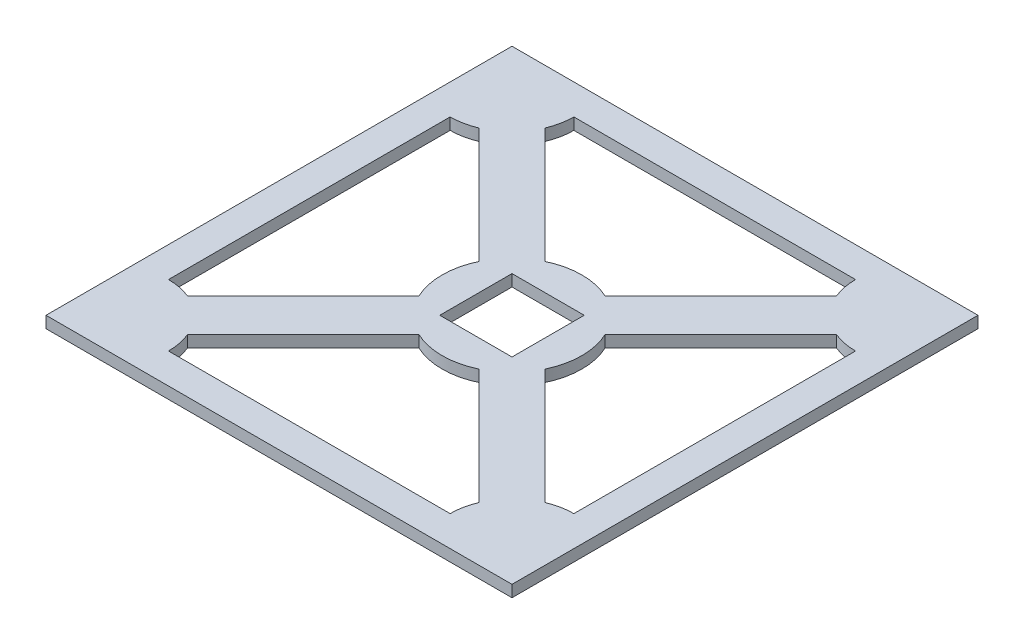
ISO-10303-21;
HEADER;
FILE_DESCRIPTION(('STEP AP214'),'2;1');
FILE_NAME('part.step','',(''),(''),'','','');
FILE_SCHEMA(('AUTOMOTIVE_DESIGN { 1 0 10303 214 1 1 1 1 }'));
ENDSEC;
DATA;
#1=APPLICATION_CONTEXT('core data for automotive mechanical design processes');
#2=APPLICATION_PROTOCOL_DEFINITION('international standard','automotive_design',2000,#1);
#3=PRODUCT_CONTEXT('',#1,'mechanical');
#4=PRODUCT('Part','Part','',(#3));
#5=PRODUCT_RELATED_PRODUCT_CATEGORY('part','',(#4));
#6=PRODUCT_DEFINITION_FORMATION('','',#4);
#7=PRODUCT_DEFINITION_CONTEXT('part definition',#1,'design');
#8=PRODUCT_DEFINITION('design','',#6,#7);
#9=PRODUCT_DEFINITION_SHAPE('','',#8);
#10=(LENGTH_UNIT() NAMED_UNIT(*) SI_UNIT(.MILLI.,.METRE.));
#11=(NAMED_UNIT(*) PLANE_ANGLE_UNIT() SI_UNIT($,.RADIAN.));
#12=(NAMED_UNIT(*) SI_UNIT($,.STERADIAN.) SOLID_ANGLE_UNIT());
#13=UNCERTAINTY_MEASURE_WITH_UNIT(LENGTH_MEASURE(1.E-05),#10,'distance_accuracy_value','');
#14=(GEOMETRIC_REPRESENTATION_CONTEXT(3) GLOBAL_UNCERTAINTY_ASSIGNED_CONTEXT((#13)) GLOBAL_UNIT_ASSIGNED_CONTEXT((#10,
#11,#12)) REPRESENTATION_CONTEXT('',''));
#15=CARTESIAN_POINT('',(0.,0.,0.));
#16=DIRECTION('',(0.,0.,1.));
#17=DIRECTION('',(1.,0.,0.));
#18=AXIS2_PLACEMENT_3D('',#15,#16,#17);
#19=CARTESIAN_POINT('',(0.,0.,0.));
#20=DIRECTION('',(0.,1.,0.));
#21=DIRECTION('',(0.,0.,1.));
#22=AXIS2_PLACEMENT_3D('',#19,#20,#21);
#23=CYLINDRICAL_SURFACE('',#22,15.);
#24=CARTESIAN_POINT('',(0.,2.5,0.));
#25=DIRECTION('',(0.,1.,0.));
#26=DIRECTION('',(0.,0.,1.));
#27=AXIS2_PLACEMENT_3D('',#24,#25,#26);
#28=CIRCLE('',#27,15.);
#29=CARTESIAN_POINT('',(-13.5355339059327,2.5,-6.46446609406726));
#30=VERTEX_POINT('',#29);
#31=CARTESIAN_POINT('',(-13.5355339059327,2.5,6.46446609406726));
#32=VERTEX_POINT('',#31);
#33=EDGE_CURVE('E281',#30,#32,#28,.T.);
#34=ORIENTED_EDGE('',*,*,#33,.F.);
#35=DIRECTION('',(0.,1.,0.));
#36=VECTOR('',#35,1.);
#37=CARTESIAN_POINT('',(-13.5355339059327,0.,-6.46446609406726));
#38=LINE('',#37,#36);
#39=CARTESIAN_POINT('',(-13.5355339059327,0.,-6.46446609406726));
#40=VERTEX_POINT('',#39);
#41=EDGE_CURVE('E272',#30,#40,#38,.F.);
#42=ORIENTED_EDGE('',*,*,#41,.T.);
#43=CARTESIAN_POINT('',(0.,0.,0.));
#44=DIRECTION('',(0.,1.,0.));
#45=DIRECTION('',(0.,0.,1.));
#46=AXIS2_PLACEMENT_3D('',#43,#44,#45);
#47=CIRCLE('',#46,15.);
#48=CARTESIAN_POINT('',(-13.5355339059327,0.,6.46446609406726));
#49=VERTEX_POINT('',#48);
#50=EDGE_CURVE('E319',#40,#49,#47,.T.);
#51=ORIENTED_EDGE('',*,*,#50,.T.);
#52=DIRECTION('',(0.,1.,0.));
#53=VECTOR('',#52,1.);
#54=CARTESIAN_POINT('',(-13.5355339059327,0.,6.46446609406726));
#55=LINE('',#54,#53);
#56=EDGE_CURVE('E523',#32,#49,#55,.F.);
#57=ORIENTED_EDGE('',*,*,#56,.F.);
#58=EDGE_LOOP('',(#34,#42,#51,#57));
#59=FACE_BOUND('',#58,.T.);
#60=ADVANCED_FACE('F47',(#59),#23,.T.);
#61=CARTESIAN_POINT('',(-43.5,0.,-43.5));
#62=DIRECTION('',(0.,1.,0.));
#63=DIRECTION('',(0.,0.,1.));
#64=AXIS2_PLACEMENT_3D('',#61,#62,#63);
#65=CYLINDRICAL_SURFACE('',#64,13.279930536569);
#66=CARTESIAN_POINT('',(-43.5,0.,-43.5));
#67=DIRECTION('',(0.,1.,0.));
#68=DIRECTION('',(0.,0.,1.));
#69=AXIS2_PLACEMENT_3D('',#66,#67,#68);
#70=CIRCLE('',#69,13.279930536569);
#71=CARTESIAN_POINT('',(-43.5,0.,-30.220069463431));
#72=VERTEX_POINT('',#71);
#73=CARTESIAN_POINT('',(-38.3362076373043,0.,-31.2651398254388));
#74=VERTEX_POINT('',#73);
#75=EDGE_CURVE('E552',#72,#74,#70,.T.);
#76=ORIENTED_EDGE('',*,*,#75,.T.);
#77=DIRECTION('',(0.,1.,0.));
#78=VECTOR('',#77,1.);
#79=CARTESIAN_POINT('',(-38.3362076373043,0.,-31.2651398254388));
#80=LINE('',#79,#78);
#81=CARTESIAN_POINT('',(-38.3362076373043,2.5,-31.2651398254388));
#82=VERTEX_POINT('',#81);
#83=EDGE_CURVE('E56',#74,#82,#80,.T.);
#84=ORIENTED_EDGE('',*,*,#83,.T.);
#85=CARTESIAN_POINT('',(-43.5,2.5,-43.5));
#86=DIRECTION('',(0.,1.,0.));
#87=DIRECTION('',(0.,0.,1.));
#88=AXIS2_PLACEMENT_3D('',#85,#86,#87);
#89=CIRCLE('',#88,13.279930536569);
#90=CARTESIAN_POINT('',(-43.5,2.5,-30.220069463431));
#91=VERTEX_POINT('',#90);
#92=EDGE_CURVE('E558',#91,#82,#89,.T.);
#93=ORIENTED_EDGE('',*,*,#92,.F.);
#94=DIRECTION('',(0.,1.,0.));
#95=VECTOR('',#94,1.);
#96=CARTESIAN_POINT('',(-43.5,0.,-30.220069463431));
#97=LINE('',#96,#95);
#98=EDGE_CURVE('E556',#72,#91,#97,.T.);
#99=ORIENTED_EDGE('',*,*,#98,.F.);
#100=EDGE_LOOP('',(#76,#84,#93,#99));
#101=FACE_BOUND('',#100,.T.);
#102=ADVANCED_FACE('F425',(#101),#65,.T.);
#103=DIRECTION('',(0.,1.,0.));
#104=VECTOR('',#103,1.);
#105=CARTESIAN_POINT('',(-6.46446609406726,0.,-13.5355339059327));
#106=LINE('',#105,#104);
#107=CARTESIAN_POINT('',(-6.46446609406726,2.5,-13.5355339059327));
#108=VERTEX_POINT('',#107);
#109=CARTESIAN_POINT('',(-6.46446609406726,0.,-13.5355339059327));
#110=VERTEX_POINT('',#109);
#111=EDGE_CURVE('E256',#108,#110,#106,.F.);
#112=ORIENTED_EDGE('',*,*,#111,.F.);
#113=CARTESIAN_POINT('',(6.46446609406726,2.5,-13.5355339059327));
#114=VERTEX_POINT('',#113);
#115=EDGE_CURVE('E267',#114,#108,#28,.T.);
#116=ORIENTED_EDGE('',*,*,#115,.F.);
#117=DIRECTION('',(0.,1.,0.));
#118=VECTOR('',#117,1.);
#119=CARTESIAN_POINT('',(6.46446609406726,0.,-13.5355339059327));
#120=LINE('',#119,#118);
#121=CARTESIAN_POINT('',(6.46446609406726,0.,-13.5355339059327));
#122=VERTEX_POINT('',#121);
#123=EDGE_CURVE('E500',#114,#122,#120,.F.);
#124=ORIENTED_EDGE('',*,*,#123,.T.);
#125=EDGE_CURVE('E269',#122,#110,#47,.T.);
#126=ORIENTED_EDGE('',*,*,#125,.T.);
#127=EDGE_LOOP('',(#112,#116,#124,#126));
#128=FACE_BOUND('',#127,.T.);
#129=ADVANCED_FACE('F265',(#128),#23,.T.);
#130=CARTESIAN_POINT('',(43.5,0.,-43.5));
#131=DIRECTION('',(0.,1.,0.));
#132=DIRECTION('',(0.,0.,1.));
#133=AXIS2_PLACEMENT_3D('',#130,#131,#132);
#134=CYLINDRICAL_SURFACE('',#133,13.279930536569);
#135=DIRECTION('',(0.,1.,0.));
#136=VECTOR('',#135,1.);
#137=CARTESIAN_POINT('',(31.2651398254388,0.,-38.3362076373043));
#138=LINE('',#137,#136);
#139=CARTESIAN_POINT('',(31.2651398254388,2.5,-38.3362076373043));
#140=VERTEX_POINT('',#139);
#141=CARTESIAN_POINT('',(31.2651398254388,0.,-38.3362076373043));
#142=VERTEX_POINT('',#141);
#143=EDGE_CURVE('E489',#140,#142,#138,.F.);
#144=ORIENTED_EDGE('',*,*,#143,.F.);
#145=CARTESIAN_POINT('',(43.5,2.5,-43.5));
#146=DIRECTION('',(0.,1.,0.));
#147=DIRECTION('',(0.,0.,1.));
#148=AXIS2_PLACEMENT_3D('',#145,#146,#147);
#149=CIRCLE('',#148,13.279930536569);
#150=CARTESIAN_POINT('',(30.220069463431,2.5,-43.5));
#151=VERTEX_POINT('',#150);
#152=EDGE_CURVE('E481',#140,#151,#149,.F.);
#153=ORIENTED_EDGE('',*,*,#152,.T.);
#154=DIRECTION('',(0.,1.,0.));
#155=VECTOR('',#154,1.);
#156=CARTESIAN_POINT('',(30.220069463431,0.,-43.5));
#157=LINE('',#156,#155);
#158=CARTESIAN_POINT('',(30.220069463431,0.,-43.5));
#159=VERTEX_POINT('',#158);
#160=EDGE_CURVE('E545',#159,#151,#157,.T.);
#161=ORIENTED_EDGE('',*,*,#160,.F.);
#162=CARTESIAN_POINT('',(43.5,0.,-43.5));
#163=DIRECTION('',(0.,1.,0.));
#164=DIRECTION('',(0.,0.,1.));
#165=AXIS2_PLACEMENT_3D('',#162,#163,#164);
#166=CIRCLE('',#165,13.279930536569);
#167=EDGE_CURVE('E480',#142,#159,#166,.F.);
#168=ORIENTED_EDGE('',*,*,#167,.F.);
#169=EDGE_LOOP('',(#144,#153,#161,#168));
#170=FACE_BOUND('',#169,.T.);
#171=ADVANCED_FACE('F435',(#170),#134,.T.);
#172=CARTESIAN_POINT('',(-6.46446609406726,2.5,13.5355339059327));
#173=VERTEX_POINT('',#172);
#174=CARTESIAN_POINT('',(6.46446609406726,2.5,13.5355339059327));
#175=VERTEX_POINT('',#174);
#176=EDGE_CURVE('E283',#173,#175,#28,.T.);
#177=ORIENTED_EDGE('',*,*,#176,.F.);
#178=DIRECTION('',(0.,1.,0.));
#179=VECTOR('',#178,1.);
#180=CARTESIAN_POINT('',(-6.46446609406726,0.,13.5355339059327));
#181=LINE('',#180,#179);
#182=CARTESIAN_POINT('',(-6.46446609406726,0.,13.5355339059327));
#183=VERTEX_POINT('',#182);
#184=EDGE_CURVE('E338',#173,#183,#181,.F.);
#185=ORIENTED_EDGE('',*,*,#184,.T.);
#186=CARTESIAN_POINT('',(6.46446609406726,0.,13.5355339059327));
#187=VERTEX_POINT('',#186);
#188=EDGE_CURVE('E287',#183,#187,#47,.T.);
#189=ORIENTED_EDGE('',*,*,#188,.T.);
#190=DIRECTION('',(0.,1.,0.));
#191=VECTOR('',#190,1.);
#192=CARTESIAN_POINT('',(6.46446609406726,0.,13.5355339059327));
#193=LINE('',#192,#191);
#194=EDGE_CURVE('E336',#175,#187,#193,.F.);
#195=ORIENTED_EDGE('',*,*,#194,.F.);
#196=EDGE_LOOP('',(#177,#185,#189,#195));
#197=FACE_BOUND('',#196,.T.);
#198=ADVANCED_FACE('F335',(#197),#23,.T.);
#199=CARTESIAN_POINT('',(-43.5,0.,43.5));
#200=DIRECTION('',(0.,1.,0.));
#201=DIRECTION('',(0.,0.,1.));
#202=AXIS2_PLACEMENT_3D('',#199,#200,#201);
#203=CYLINDRICAL_SURFACE('',#202,13.279930536569);
#204=DIRECTION('',(0.,1.,0.));
#205=VECTOR('',#204,1.);
#206=CARTESIAN_POINT('',(-31.2651398254388,0.,38.3362076373043));
#207=LINE('',#206,#205);
#208=CARTESIAN_POINT('',(-31.2651398254388,2.5,38.3362076373043));
#209=VERTEX_POINT('',#208);
#210=CARTESIAN_POINT('',(-31.2651398254388,0.,38.3362076373043));
#211=VERTEX_POINT('',#210);
#212=EDGE_CURVE('E327',#209,#211,#207,.F.);
#213=ORIENTED_EDGE('',*,*,#212,.F.);
#214=CARTESIAN_POINT('',(-43.5,2.5,43.5));
#215=DIRECTION('',(0.,1.,0.));
#216=DIRECTION('',(0.,0.,1.));
#217=AXIS2_PLACEMENT_3D('',#214,#215,#216);
#218=CIRCLE('',#217,13.279930536569);
#219=CARTESIAN_POINT('',(-30.220069463431,2.5,43.5));
#220=VERTEX_POINT('',#219);
#221=EDGE_CURVE('E565',#209,#220,#218,.F.);
#222=ORIENTED_EDGE('',*,*,#221,.T.);
#223=DIRECTION('',(0.,1.,0.));
#224=VECTOR('',#223,1.);
#225=CARTESIAN_POINT('',(-30.220069463431,0.,43.5));
#226=LINE('',#225,#224);
#227=CARTESIAN_POINT('',(-30.220069463431,0.,43.5));
#228=VERTEX_POINT('',#227);
#229=EDGE_CURVE('E577',#228,#220,#226,.T.);
#230=ORIENTED_EDGE('',*,*,#229,.F.);
#231=CARTESIAN_POINT('',(-43.5,0.,43.5));
#232=DIRECTION('',(0.,1.,0.));
#233=DIRECTION('',(0.,0.,1.));
#234=AXIS2_PLACEMENT_3D('',#231,#232,#233);
#235=CIRCLE('',#234,13.279930536569);
#236=EDGE_CURVE('E573',#211,#228,#235,.F.);
#237=ORIENTED_EDGE('',*,*,#236,.F.);
#238=EDGE_LOOP('',(#213,#222,#230,#237));
#239=FACE_BOUND('',#238,.T.);
#240=ADVANCED_FACE('F437',(#239),#203,.T.);
#241=DIRECTION('',(0.,1.,0.));
#242=VECTOR('',#241,1.);
#243=CARTESIAN_POINT('',(13.5355339059327,0.,-6.46446609406726));
#244=LINE('',#243,#242);
#245=CARTESIAN_POINT('',(13.5355339059327,2.5,-6.46446609406726));
#246=VERTEX_POINT('',#245);
#247=CARTESIAN_POINT('',(13.5355339059327,0.,-6.46446609406726));
#248=VERTEX_POINT('',#247);
#249=EDGE_CURVE('E503',#246,#248,#244,.F.);
#250=ORIENTED_EDGE('',*,*,#249,.F.);
#251=CARTESIAN_POINT('',(13.5355339059327,2.5,6.46446609406726));
#252=VERTEX_POINT('',#251);
#253=EDGE_CURVE('E280',#252,#246,#28,.T.);
#254=ORIENTED_EDGE('',*,*,#253,.F.);
#255=DIRECTION('',(0.,1.,0.));
#256=VECTOR('',#255,1.);
#257=CARTESIAN_POINT('',(13.5355339059327,0.,6.46446609406726));
#258=LINE('',#257,#256);
#259=CARTESIAN_POINT('',(13.5355339059327,0.,6.46446609406726));
#260=VERTEX_POINT('',#259);
#261=EDGE_CURVE('E350',#252,#260,#258,.F.);
#262=ORIENTED_EDGE('',*,*,#261,.T.);
#263=EDGE_CURVE('E315',#260,#248,#47,.T.);
#264=ORIENTED_EDGE('',*,*,#263,.T.);
#265=EDGE_LOOP('',(#250,#254,#262,#264));
#266=FACE_BOUND('',#265,.T.);
#267=ADVANCED_FACE('F49',(#266),#23,.T.);
#268=CARTESIAN_POINT('',(0.,0.,0.));
#269=DIRECTION('',(0.,1.,0.));
#270=DIRECTION('',(0.,0.,1.));
#271=AXIS2_PLACEMENT_3D('',#268,#269,#270);
#272=PLANE('',#271);
#273=ORIENTED_EDGE('',*,*,#50,.F.);
#274=DIRECTION('',(-0.707106781186548,0.,-0.707106781186547));
#275=VECTOR('',#274,1.);
#276=CARTESIAN_POINT('',(-11.2855339059327,0.,-4.21446609406726));
#277=LINE('',#276,#275);
#278=EDGE_CURVE('E679',#40,#74,#277,.T.);
#279=ORIENTED_EDGE('',*,*,#278,.T.);
#280=ORIENTED_EDGE('',*,*,#75,.F.);
#281=DIRECTION('',(0.,0.,-1.));
#282=VECTOR('',#281,1.);
#283=CARTESIAN_POINT('',(-43.5,0.,0.));
#284=LINE('',#283,#282);
#285=CARTESIAN_POINT('',(-43.5,0.,30.220069463431));
#286=VERTEX_POINT('',#285);
#287=EDGE_CURVE('E644',#286,#72,#284,.T.);
#288=ORIENTED_EDGE('',*,*,#287,.F.);
#289=CARTESIAN_POINT('',(-38.3362076373043,0.,31.2651398254388));
#290=VERTEX_POINT('',#289);
#291=EDGE_CURVE('E568',#286,#290,#235,.F.);
#292=ORIENTED_EDGE('',*,*,#291,.T.);
#293=DIRECTION('',(-0.707106781186548,0.,0.707106781186547));
#294=VECTOR('',#293,1.);
#295=CARTESIAN_POINT('',(-11.2855339059327,0.,4.21446609406726));
#296=LINE('',#295,#294);
#297=EDGE_CURVE('E507',#49,#290,#296,.T.);
#298=ORIENTED_EDGE('',*,*,#297,.F.);
#299=EDGE_LOOP('',(#273,#279,#280,#288,#292,#298));
#300=FACE_BOUND('',#299,.T.);
#301=DIRECTION('',(-0.707106781186548,0.,-0.707106781186547));
#302=VECTOR('',#301,1.);
#303=CARTESIAN_POINT('',(-4.21446609406726,0.,-11.2855339059327));
#304=LINE('',#303,#302);
#305=CARTESIAN_POINT('',(-31.2651398254388,0.,-38.3362076373043));
#306=VERTEX_POINT('',#305);
#307=EDGE_CURVE('E681',#110,#306,#304,.T.);
#308=ORIENTED_EDGE('',*,*,#307,.F.);
#309=ORIENTED_EDGE('',*,*,#125,.F.);
#310=DIRECTION('',(0.707106781186548,0.,-0.707106781186547));
#311=VECTOR('',#310,1.);
#312=CARTESIAN_POINT('',(4.21446609406726,0.,-11.2855339059327));
#313=LINE('',#312,#311);
#314=EDGE_CURVE('E497',#122,#142,#313,.T.);
#315=ORIENTED_EDGE('',*,*,#314,.T.);
#316=ORIENTED_EDGE('',*,*,#167,.T.);
#317=DIRECTION('',(1.,0.,0.));
#318=VECTOR('',#317,1.);
#319=CARTESIAN_POINT('',(0.,0.,-43.5));
#320=LINE('',#319,#318);
#321=CARTESIAN_POINT('',(-30.220069463431,0.,-43.5));
#322=VERTEX_POINT('',#321);
#323=EDGE_CURVE('E640',#322,#159,#320,.T.);
#324=ORIENTED_EDGE('',*,*,#323,.F.);
#325=EDGE_CURVE('E557',#306,#322,#70,.T.);
#326=ORIENTED_EDGE('',*,*,#325,.F.);
#327=EDGE_LOOP('',(#308,#309,#315,#316,#324,#326));
#328=FACE_BOUND('',#327,.T.);
#329=DIRECTION('',(-1.,0.,0.));
#330=VECTOR('',#329,1.);
#331=CARTESIAN_POINT('',(-7.75,0.,-7.75));
#332=LINE('',#331,#330);
#333=CARTESIAN_POINT('',(7.75,0.,-7.75));
#334=VERTEX_POINT('',#333);
#335=CARTESIAN_POINT('',(-7.75,0.,-7.75));
#336=VERTEX_POINT('',#335);
#337=EDGE_CURVE('E379',#334,#336,#332,.T.);
#338=ORIENTED_EDGE('',*,*,#337,.T.);
#339=DIRECTION('',(0.,0.,1.));
#340=VECTOR('',#339,1.);
#341=CARTESIAN_POINT('',(-7.75,0.,7.75));
#342=LINE('',#341,#340);
#343=CARTESIAN_POINT('',(-7.75,0.,7.75));
#344=VERTEX_POINT('',#343);
#345=EDGE_CURVE('E383',#336,#344,#342,.T.);
#346=ORIENTED_EDGE('',*,*,#345,.T.);
#347=DIRECTION('',(1.,0.,0.));
#348=VECTOR('',#347,1.);
#349=CARTESIAN_POINT('',(-7.75,0.,7.75));
#350=LINE('',#349,#348);
#351=CARTESIAN_POINT('',(7.75,0.,7.75));
#352=VERTEX_POINT('',#351);
#353=EDGE_CURVE('E314',#344,#352,#350,.T.);
#354=ORIENTED_EDGE('',*,*,#353,.T.);
#355=DIRECTION('',(0.,0.,-1.));
#356=VECTOR('',#355,1.);
#357=CARTESIAN_POINT('',(7.75,0.,7.75));
#358=LINE('',#357,#356);
#359=EDGE_CURVE('E375',#352,#334,#358,.T.);
#360=ORIENTED_EDGE('',*,*,#359,.T.);
#361=EDGE_LOOP('',(#338,#346,#354,#360));
#362=FACE_BOUND('',#361,.T.);
#363=DIRECTION('',(0.707106781186548,0.,-0.707106781186547));
#364=VECTOR('',#363,1.);
#365=CARTESIAN_POINT('',(11.2855339059327,0.,-4.21446609406726));
#366=LINE('',#365,#364);
#367=CARTESIAN_POINT('',(38.3362076373043,0.,-31.2651398254388));
#368=VERTEX_POINT('',#367);
#369=EDGE_CURVE('E487',#248,#368,#366,.T.);
#370=ORIENTED_EDGE('',*,*,#369,.F.);
#371=ORIENTED_EDGE('',*,*,#263,.F.);
#372=DIRECTION('',(0.707106781186548,0.,0.707106781186547));
#373=VECTOR('',#372,1.);
#374=CARTESIAN_POINT('',(11.2855339059327,0.,4.21446609406726));
#375=LINE('',#374,#373);
#376=CARTESIAN_POINT('',(38.3362076373043,0.,31.2651398254388));
#377=VERTEX_POINT('',#376);
#378=EDGE_CURVE('E358',#260,#377,#375,.T.);
#379=ORIENTED_EDGE('',*,*,#378,.T.);
#380=CARTESIAN_POINT('',(43.5,0.,43.5));
#381=DIRECTION('',(0.,1.,0.));
#382=DIRECTION('',(0.,0.,1.));
#383=AXIS2_PLACEMENT_3D('',#380,#381,#382);
#384=CIRCLE('',#383,13.279930536569);
#385=CARTESIAN_POINT('',(43.5,0.,30.220069463431));
#386=VERTEX_POINT('',#385);
#387=EDGE_CURVE('E528',#386,#377,#384,.T.);
#388=ORIENTED_EDGE('',*,*,#387,.F.);
#389=DIRECTION('',(0.,0.,1.));
#390=VECTOR('',#389,1.);
#391=CARTESIAN_POINT('',(43.5,0.,0.));
#392=LINE('',#391,#390);
#393=CARTESIAN_POINT('',(43.5,0.,-30.220069463431));
#394=VERTEX_POINT('',#393);
#395=EDGE_CURVE('E650',#394,#386,#392,.T.);
#396=ORIENTED_EDGE('',*,*,#395,.F.);
#397=EDGE_CURVE('E542',#394,#368,#166,.F.);
#398=ORIENTED_EDGE('',*,*,#397,.T.);
#399=EDGE_LOOP('',(#370,#371,#379,#388,#396,#398));
#400=FACE_BOUND('',#399,.T.);
#401=ORIENTED_EDGE('',*,*,#188,.F.);
#402=DIRECTION('',(-0.707106781186548,0.,0.707106781186547));
#403=VECTOR('',#402,1.);
#404=CARTESIAN_POINT('',(-4.21446609406726,0.,11.2855339059327));
#405=LINE('',#404,#403);
#406=EDGE_CURVE('E511',#183,#211,#405,.T.);
#407=ORIENTED_EDGE('',*,*,#406,.T.);
#408=ORIENTED_EDGE('',*,*,#236,.T.);
#409=DIRECTION('',(-1.,0.,0.));
#410=VECTOR('',#409,1.);
#411=CARTESIAN_POINT('',(0.,0.,43.5));
#412=LINE('',#411,#410);
#413=CARTESIAN_POINT('',(30.220069463431,0.,43.5));
#414=VERTEX_POINT('',#413);
#415=EDGE_CURVE('E647',#414,#228,#412,.T.);
#416=ORIENTED_EDGE('',*,*,#415,.F.);
#417=CARTESIAN_POINT('',(31.2651398254388,0.,38.3362076373043));
#418=VERTEX_POINT('',#417);
#419=EDGE_CURVE('E356',#418,#414,#384,.T.);
#420=ORIENTED_EDGE('',*,*,#419,.F.);
#421=DIRECTION('',(0.707106781186548,0.,0.707106781186547));
#422=VECTOR('',#421,1.);
#423=CARTESIAN_POINT('',(4.21446609406726,0.,11.2855339059327));
#424=LINE('',#423,#422);
#425=EDGE_CURVE('E346',#187,#418,#424,.T.);
#426=ORIENTED_EDGE('',*,*,#425,.F.);
#427=EDGE_LOOP('',(#401,#407,#408,#416,#420,#426));
#428=FACE_BOUND('',#427,.T.);
#429=DIRECTION('',(0.,0.,-1.));
#430=VECTOR('',#429,1.);
#431=CARTESIAN_POINT('',(50.,0.,50.));
#432=LINE('',#431,#430);
#433=CARTESIAN_POINT('',(50.,0.,50.));
#434=VERTEX_POINT('',#433);
#435=CARTESIAN_POINT('',(50.,0.,-50.));
#436=VERTEX_POINT('',#435);
#437=EDGE_CURVE('E598',#434,#436,#432,.T.);
#438=ORIENTED_EDGE('',*,*,#437,.F.);
#439=DIRECTION('',(1.,0.,0.));
#440=VECTOR('',#439,1.);
#441=CARTESIAN_POINT('',(-50.,0.,50.));
#442=LINE('',#441,#440);
#443=CARTESIAN_POINT('',(-50.,0.,50.));
#444=VERTEX_POINT('',#443);
#445=EDGE_CURVE('E604',#444,#434,#442,.T.);
#446=ORIENTED_EDGE('',*,*,#445,.F.);
#447=DIRECTION('',(0.,0.,1.));
#448=VECTOR('',#447,1.);
#449=CARTESIAN_POINT('',(-50.,0.,50.));
#450=LINE('',#449,#448);
#451=CARTESIAN_POINT('',(-50.,0.,-50.));
#452=VERTEX_POINT('',#451);
#453=EDGE_CURVE('E620',#452,#444,#450,.T.);
#454=ORIENTED_EDGE('',*,*,#453,.F.);
#455=DIRECTION('',(-1.,0.,0.));
#456=VECTOR('',#455,1.);
#457=CARTESIAN_POINT('',(-50.,0.,-50.));
#458=LINE('',#457,#456);
#459=EDGE_CURVE('E617',#436,#452,#458,.T.);
#460=ORIENTED_EDGE('',*,*,#459,.F.);
#461=EDGE_LOOP('',(#438,#446,#454,#460));
#462=FACE_BOUND('',#461,.T.);
#463=ADVANCED_FACE('F353',(#300,#328,#362,#400,#428,#462),#272,.F.);
#464=CARTESIAN_POINT('',(0.,2.5,0.));
#465=DIRECTION('',(0.,1.,0.));
#466=DIRECTION('',(0.,0.,1.));
#467=AXIS2_PLACEMENT_3D('',#464,#465,#466);
#468=PLANE('',#467);
#469=DIRECTION('',(-0.707106781186548,0.,-0.707106781186547));
#470=VECTOR('',#469,1.);
#471=CARTESIAN_POINT('',(-11.2855339059327,2.5,-4.21446609406726));
#472=LINE('',#471,#470);
#473=EDGE_CURVE('E63',#30,#82,#472,.T.);
#474=ORIENTED_EDGE('',*,*,#473,.F.);
#475=ORIENTED_EDGE('',*,*,#33,.T.);
#476=DIRECTION('',(-0.707106781186548,0.,0.707106781186547));
#477=VECTOR('',#476,1.);
#478=CARTESIAN_POINT('',(-11.2855339059327,2.5,4.21446609406726));
#479=LINE('',#478,#477);
#480=CARTESIAN_POINT('',(-38.3362076373043,2.5,31.2651398254388));
#481=VERTEX_POINT('',#480);
#482=EDGE_CURVE('E506',#32,#481,#479,.T.);
#483=ORIENTED_EDGE('',*,*,#482,.T.);
#484=CARTESIAN_POINT('',(-43.5,2.5,30.220069463431));
#485=VERTEX_POINT('',#484);
#486=EDGE_CURVE('E574',#485,#481,#218,.F.);
#487=ORIENTED_EDGE('',*,*,#486,.F.);
#488=DIRECTION('',(0.,0.,1.));
#489=VECTOR('',#488,1.);
#490=CARTESIAN_POINT('',(-43.5,2.5,43.5));
#491=LINE('',#490,#489);
#492=EDGE_CURVE('E591',#91,#485,#491,.T.);
#493=ORIENTED_EDGE('',*,*,#492,.F.);
#494=ORIENTED_EDGE('',*,*,#92,.T.);
#495=EDGE_LOOP('',(#474,#475,#483,#487,#493,#494));
#496=FACE_BOUND('',#495,.T.);
#497=ORIENTED_EDGE('',*,*,#115,.T.);
#498=DIRECTION('',(-0.707106781186548,0.,-0.707106781186547));
#499=VECTOR('',#498,1.);
#500=CARTESIAN_POINT('',(-4.21446609406726,2.5,-11.2855339059327));
#501=LINE('',#500,#499);
#502=CARTESIAN_POINT('',(-31.2651398254388,2.5,-38.3362076373043));
#503=VERTEX_POINT('',#502);
#504=EDGE_CURVE('E71',#108,#503,#501,.T.);
#505=ORIENTED_EDGE('',*,*,#504,.T.);
#506=CARTESIAN_POINT('',(-30.220069463431,2.5,-43.5));
#507=VERTEX_POINT('',#506);
#508=EDGE_CURVE('E549',#503,#507,#89,.T.);
#509=ORIENTED_EDGE('',*,*,#508,.T.);
#510=DIRECTION('',(-1.,0.,0.));
#511=VECTOR('',#510,1.);
#512=CARTESIAN_POINT('',(-43.5,2.5,-43.5));
#513=LINE('',#512,#511);
#514=EDGE_CURVE('E587',#151,#507,#513,.T.);
#515=ORIENTED_EDGE('',*,*,#514,.F.);
#516=ORIENTED_EDGE('',*,*,#152,.F.);
#517=DIRECTION('',(0.707106781186548,0.,-0.707106781186547));
#518=VECTOR('',#517,1.);
#519=CARTESIAN_POINT('',(4.21446609406726,2.5,-11.2855339059327));
#520=LINE('',#519,#518);
#521=EDGE_CURVE('E277',#114,#140,#520,.T.);
#522=ORIENTED_EDGE('',*,*,#521,.F.);
#523=EDGE_LOOP('',(#497,#505,#509,#515,#516,#522));
#524=FACE_BOUND('',#523,.T.);
#525=DIRECTION('',(0.,0.,1.));
#526=VECTOR('',#525,1.);
#527=CARTESIAN_POINT('',(-7.75,2.5,7.75));
#528=LINE('',#527,#526);
#529=CARTESIAN_POINT('',(-7.75,2.5,-7.75));
#530=VERTEX_POINT('',#529);
#531=CARTESIAN_POINT('',(-7.75,2.5,7.75));
#532=VERTEX_POINT('',#531);
#533=EDGE_CURVE('E395',#530,#532,#528,.T.);
#534=ORIENTED_EDGE('',*,*,#533,.F.);
#535=DIRECTION('',(-1.,0.,0.));
#536=VECTOR('',#535,1.);
#537=CARTESIAN_POINT('',(-7.75,2.5,-7.75));
#538=LINE('',#537,#536);
#539=CARTESIAN_POINT('',(7.75,2.5,-7.75));
#540=VERTEX_POINT('',#539);
#541=EDGE_CURVE('E392',#540,#530,#538,.T.);
#542=ORIENTED_EDGE('',*,*,#541,.F.);
#543=DIRECTION('',(0.,0.,-1.));
#544=VECTOR('',#543,1.);
#545=CARTESIAN_POINT('',(7.75,2.5,7.75));
#546=LINE('',#545,#544);
#547=CARTESIAN_POINT('',(7.75,2.5,7.75));
#548=VERTEX_POINT('',#547);
#549=EDGE_CURVE('E349',#548,#540,#546,.T.);
#550=ORIENTED_EDGE('',*,*,#549,.F.);
#551=DIRECTION('',(1.,0.,0.));
#552=VECTOR('',#551,1.);
#553=CARTESIAN_POINT('',(-7.75,2.5,7.75));
#554=LINE('',#553,#552);
#555=EDGE_CURVE('E306',#532,#548,#554,.T.);
#556=ORIENTED_EDGE('',*,*,#555,.F.);
#557=EDGE_LOOP('',(#534,#542,#550,#556));
#558=FACE_BOUND('',#557,.T.);
#559=ORIENTED_EDGE('',*,*,#253,.T.);
#560=DIRECTION('',(0.707106781186548,0.,-0.707106781186547));
#561=VECTOR('',#560,1.);
#562=CARTESIAN_POINT('',(11.2855339059327,2.5,-4.21446609406726));
#563=LINE('',#562,#561);
#564=CARTESIAN_POINT('',(38.3362076373043,2.5,-31.2651398254388));
#565=VERTEX_POINT('',#564);
#566=EDGE_CURVE('E271',#246,#565,#563,.T.);
#567=ORIENTED_EDGE('',*,*,#566,.T.);
#568=CARTESIAN_POINT('',(43.5,2.5,-30.220069463431));
#569=VERTEX_POINT('',#568);
#570=EDGE_CURVE('E471',#569,#565,#149,.F.);
#571=ORIENTED_EDGE('',*,*,#570,.F.);
#572=DIRECTION('',(0.,0.,-1.));
#573=VECTOR('',#572,1.);
#574=CARTESIAN_POINT('',(43.5,2.5,43.5));
#575=LINE('',#574,#573);
#576=CARTESIAN_POINT('',(43.5,2.5,30.220069463431));
#577=VERTEX_POINT('',#576);
#578=EDGE_CURVE('E581',#577,#569,#575,.T.);
#579=ORIENTED_EDGE('',*,*,#578,.F.);
#580=CARTESIAN_POINT('',(43.5,2.5,43.5));
#581=DIRECTION('',(0.,1.,0.));
#582=DIRECTION('',(0.,0.,1.));
#583=AXIS2_PLACEMENT_3D('',#580,#581,#582);
#584=CIRCLE('',#583,13.279930536569);
#585=CARTESIAN_POINT('',(38.3362076373043,2.5,31.2651398254388));
#586=VERTEX_POINT('',#585);
#587=EDGE_CURVE('E532',#577,#586,#584,.T.);
#588=ORIENTED_EDGE('',*,*,#587,.T.);
#589=DIRECTION('',(0.707106781186548,0.,0.707106781186547));
#590=VECTOR('',#589,1.);
#591=CARTESIAN_POINT('',(11.2855339059327,2.5,4.21446609406726));
#592=LINE('',#591,#590);
#593=EDGE_CURVE('E359',#252,#586,#592,.T.);
#594=ORIENTED_EDGE('',*,*,#593,.F.);
#595=EDGE_LOOP('',(#559,#567,#571,#579,#588,#594));
#596=FACE_BOUND('',#595,.T.);
#597=DIRECTION('',(-0.707106781186548,0.,0.707106781186547));
#598=VECTOR('',#597,1.);
#599=CARTESIAN_POINT('',(-4.21446609406726,2.5,11.2855339059327));
#600=LINE('',#599,#598);
#601=EDGE_CURVE('E512',#173,#209,#600,.T.);
#602=ORIENTED_EDGE('',*,*,#601,.F.);
#603=ORIENTED_EDGE('',*,*,#176,.T.);
#604=DIRECTION('',(0.707106781186548,0.,0.707106781186547));
#605=VECTOR('',#604,1.);
#606=CARTESIAN_POINT('',(4.21446609406726,2.5,11.2855339059327));
#607=LINE('',#606,#605);
#608=CARTESIAN_POINT('',(31.2651398254388,2.5,38.3362076373043));
#609=VERTEX_POINT('',#608);
#610=EDGE_CURVE('E347',#175,#609,#607,.T.);
#611=ORIENTED_EDGE('',*,*,#610,.T.);
#612=CARTESIAN_POINT('',(30.220069463431,2.5,43.5));
#613=VERTEX_POINT('',#612);
#614=EDGE_CURVE('E527',#609,#613,#584,.T.);
#615=ORIENTED_EDGE('',*,*,#614,.T.);
#616=DIRECTION('',(1.,0.,0.));
#617=VECTOR('',#616,1.);
#618=CARTESIAN_POINT('',(-43.5,2.5,43.5));
#619=LINE('',#618,#617);
#620=EDGE_CURVE('E594',#220,#613,#619,.T.);
#621=ORIENTED_EDGE('',*,*,#620,.F.);
#622=ORIENTED_EDGE('',*,*,#221,.F.);
#623=EDGE_LOOP('',(#602,#603,#611,#615,#621,#622));
#624=FACE_BOUND('',#623,.T.);
#625=DIRECTION('',(0.,0.,-1.));
#626=VECTOR('',#625,1.);
#627=CARTESIAN_POINT('',(50.,2.5,50.));
#628=LINE('',#627,#626);
#629=CARTESIAN_POINT('',(50.,2.5,50.));
#630=VERTEX_POINT('',#629);
#631=CARTESIAN_POINT('',(50.,2.5,-50.));
#632=VERTEX_POINT('',#631);
#633=EDGE_CURVE('E599',#630,#632,#628,.T.);
#634=ORIENTED_EDGE('',*,*,#633,.T.);
#635=DIRECTION('',(-1.,0.,0.));
#636=VECTOR('',#635,1.);
#637=CARTESIAN_POINT('',(-50.,2.5,-50.));
#638=LINE('',#637,#636);
#639=CARTESIAN_POINT('',(-50.,2.5,-50.));
#640=VERTEX_POINT('',#639);
#641=EDGE_CURVE('E603',#632,#640,#638,.T.);
#642=ORIENTED_EDGE('',*,*,#641,.T.);
#643=DIRECTION('',(0.,0.,1.));
#644=VECTOR('',#643,1.);
#645=CARTESIAN_POINT('',(-50.,2.5,50.));
#646=LINE('',#645,#644);
#647=CARTESIAN_POINT('',(-50.,2.5,50.));
#648=VERTEX_POINT('',#647);
#649=EDGE_CURVE('E607',#640,#648,#646,.T.);
#650=ORIENTED_EDGE('',*,*,#649,.T.);
#651=DIRECTION('',(1.,0.,0.));
#652=VECTOR('',#651,1.);
#653=CARTESIAN_POINT('',(-50.,2.5,50.));
#654=LINE('',#653,#652);
#655=EDGE_CURVE('E610',#648,#630,#654,.T.);
#656=ORIENTED_EDGE('',*,*,#655,.T.);
#657=EDGE_LOOP('',(#634,#642,#650,#656));
#658=FACE_BOUND('',#657,.T.);
#659=ADVANCED_FACE('F274',(#496,#524,#558,#596,#624,#658),#468,.T.);
#660=CARTESIAN_POINT('',(7.75,0.,7.75));
#661=DIRECTION('',(1.,0.,0.));
#662=DIRECTION('',(0.,0.,-1.));
#663=AXIS2_PLACEMENT_3D('',#660,#661,#662);
#664=PLANE('',#663);
#665=ORIENTED_EDGE('',*,*,#549,.T.);
#666=DIRECTION('',(0.,1.,0.));
#667=VECTOR('',#666,1.);
#668=CARTESIAN_POINT('',(7.75,0.,-7.75));
#669=LINE('',#668,#667);
#670=EDGE_CURVE('E311',#334,#540,#669,.T.);
#671=ORIENTED_EDGE('',*,*,#670,.F.);
#672=ORIENTED_EDGE('',*,*,#359,.F.);
#673=DIRECTION('',(0.,1.,0.));
#674=VECTOR('',#673,1.);
#675=CARTESIAN_POINT('',(7.75,0.,7.75));
#676=LINE('',#675,#674);
#677=EDGE_CURVE('E291',#352,#548,#676,.T.);
#678=ORIENTED_EDGE('',*,*,#677,.T.);
#679=EDGE_LOOP('',(#665,#671,#672,#678));
#680=FACE_BOUND('',#679,.T.);
#681=ADVANCED_FACE('F408',(#680),#664,.F.);
#682=CARTESIAN_POINT('',(-7.75,0.,7.75));
#683=DIRECTION('',(0.,0.,1.));
#684=DIRECTION('',(1.,0.,0.));
#685=AXIS2_PLACEMENT_3D('',#682,#683,#684);
#686=PLANE('',#685);
#687=ORIENTED_EDGE('',*,*,#555,.T.);
#688=ORIENTED_EDGE('',*,*,#677,.F.);
#689=ORIENTED_EDGE('',*,*,#353,.F.);
#690=DIRECTION('',(0.,1.,0.));
#691=VECTOR('',#690,1.);
#692=CARTESIAN_POINT('',(-7.75,0.,7.75));
#693=LINE('',#692,#691);
#694=EDGE_CURVE('E297',#344,#532,#693,.T.);
#695=ORIENTED_EDGE('',*,*,#694,.T.);
#696=EDGE_LOOP('',(#687,#688,#689,#695));
#697=FACE_BOUND('',#696,.T.);
#698=ADVANCED_FACE('F404',(#697),#686,.F.);
#699=CARTESIAN_POINT('',(-7.75,0.,7.75));
#700=DIRECTION('',(-1.,0.,0.));
#701=DIRECTION('',(0.,0.,1.));
#702=AXIS2_PLACEMENT_3D('',#699,#700,#701);
#703=PLANE('',#702);
#704=ORIENTED_EDGE('',*,*,#533,.T.);
#705=ORIENTED_EDGE('',*,*,#694,.F.);
#706=ORIENTED_EDGE('',*,*,#345,.F.);
#707=DIRECTION('',(0.,1.,0.));
#708=VECTOR('',#707,1.);
#709=CARTESIAN_POINT('',(-7.75,0.,-7.75));
#710=LINE('',#709,#708);
#711=EDGE_CURVE('E303',#336,#530,#710,.T.);
#712=ORIENTED_EDGE('',*,*,#711,.T.);
#713=EDGE_LOOP('',(#704,#705,#706,#712));
#714=FACE_BOUND('',#713,.T.);
#715=ADVANCED_FACE('F415',(#714),#703,.F.);
#716=CARTESIAN_POINT('',(-7.75,0.,-7.75));
#717=DIRECTION('',(0.,0.,-1.));
#718=DIRECTION('',(-1.,0.,0.));
#719=AXIS2_PLACEMENT_3D('',#716,#717,#718);
#720=PLANE('',#719);
#721=ORIENTED_EDGE('',*,*,#541,.T.);
#722=ORIENTED_EDGE('',*,*,#711,.F.);
#723=ORIENTED_EDGE('',*,*,#337,.F.);
#724=ORIENTED_EDGE('',*,*,#670,.T.);
#725=EDGE_LOOP('',(#721,#722,#723,#724));
#726=FACE_BOUND('',#725,.T.);
#727=ADVANCED_FACE('F411',(#726),#720,.F.);
#728=CARTESIAN_POINT('',(4.21446609406726,0.,11.2855339059327));
#729=DIRECTION('',(-0.707106781186547,0.,0.707106781186548));
#730=DIRECTION('',(0.707106781186548,0.,0.707106781186547));
#731=AXIS2_PLACEMENT_3D('',#728,#729,#730);
#732=PLANE('',#731);
#733=DIRECTION('',(0.,1.,0.));
#734=VECTOR('',#733,1.);
#735=CARTESIAN_POINT('',(31.2651398254388,0.,38.3362076373043));
#736=LINE('',#735,#734);
#737=EDGE_CURVE('E368',#609,#418,#736,.F.);
#738=ORIENTED_EDGE('',*,*,#737,.F.);
#739=ORIENTED_EDGE('',*,*,#610,.F.);
#740=ORIENTED_EDGE('',*,*,#194,.T.);
#741=ORIENTED_EDGE('',*,*,#425,.T.);
#742=EDGE_LOOP('',(#738,#739,#740,#741));
#743=FACE_BOUND('',#742,.T.);
#744=ADVANCED_FACE('F345',(#743),#732,.T.);
#745=CARTESIAN_POINT('',(11.2855339059327,0.,4.21446609406726));
#746=DIRECTION('',(-0.707106781186547,0.,0.707106781186548));
#747=DIRECTION('',(0.707106781186548,0.,0.707106781186547));
#748=AXIS2_PLACEMENT_3D('',#745,#746,#747);
#749=PLANE('',#748);
#750=ORIENTED_EDGE('',*,*,#593,.T.);
#751=DIRECTION('',(0.,1.,0.));
#752=VECTOR('',#751,1.);
#753=CARTESIAN_POINT('',(38.3362076373043,0.,31.2651398254388));
#754=LINE('',#753,#752);
#755=EDGE_CURVE('E318',#586,#377,#754,.F.);
#756=ORIENTED_EDGE('',*,*,#755,.T.);
#757=ORIENTED_EDGE('',*,*,#378,.F.);
#758=ORIENTED_EDGE('',*,*,#261,.F.);
#759=EDGE_LOOP('',(#750,#756,#757,#758));
#760=FACE_BOUND('',#759,.T.);
#761=ADVANCED_FACE('F770',(#760),#749,.F.);
#762=CARTESIAN_POINT('',(43.5,0.,43.5));
#763=DIRECTION('',(0.,1.,0.));
#764=DIRECTION('',(0.,0.,1.));
#765=AXIS2_PLACEMENT_3D('',#762,#763,#764);
#766=CYLINDRICAL_SURFACE('',#765,13.279930536569);
#767=ORIENTED_EDGE('',*,*,#755,.F.);
#768=ORIENTED_EDGE('',*,*,#587,.F.);
#769=DIRECTION('',(0.,1.,0.));
#770=VECTOR('',#769,1.);
#771=CARTESIAN_POINT('',(43.5,0.,30.220069463431));
#772=LINE('',#771,#770);
#773=EDGE_CURVE('E531',#386,#577,#772,.T.);
#774=ORIENTED_EDGE('',*,*,#773,.F.);
#775=ORIENTED_EDGE('',*,*,#387,.T.);
#776=EDGE_LOOP('',(#767,#768,#774,#775));
#777=FACE_BOUND('',#776,.T.);
#778=ADVANCED_FACE('F467',(#777),#766,.T.);
#779=CARTESIAN_POINT('',(43.5,-1.5,43.5));
#780=DIRECTION('',(1.,0.,0.));
#781=DIRECTION('',(0.,0.,-1.));
#782=AXIS2_PLACEMENT_3D('',#779,#780,#781);
#783=PLANE('',#782);
#784=ORIENTED_EDGE('',*,*,#395,.T.);
#785=ORIENTED_EDGE('',*,*,#773,.T.);
#786=ORIENTED_EDGE('',*,*,#578,.T.);
#787=DIRECTION('',(0.,1.,0.));
#788=VECTOR('',#787,1.);
#789=CARTESIAN_POINT('',(43.5,0.,-30.220069463431));
#790=LINE('',#789,#788);
#791=EDGE_CURVE('E476',#394,#569,#790,.T.);
#792=ORIENTED_EDGE('',*,*,#791,.F.);
#793=EDGE_LOOP('',(#784,#785,#786,#792));
#794=FACE_BOUND('',#793,.T.);
#795=ADVANCED_FACE('F756',(#794),#783,.F.);
#796=CARTESIAN_POINT('',(-43.5,-1.5,-43.5));
#797=DIRECTION('',(0.,0.,-1.));
#798=DIRECTION('',(-1.,0.,0.));
#799=AXIS2_PLACEMENT_3D('',#796,#797,#798);
#800=PLANE('',#799);
#801=ORIENTED_EDGE('',*,*,#160,.T.);
#802=ORIENTED_EDGE('',*,*,#514,.T.);
#803=DIRECTION('',(0.,1.,0.));
#804=VECTOR('',#803,1.);
#805=CARTESIAN_POINT('',(-30.220069463431,0.,-43.5));
#806=LINE('',#805,#804);
#807=EDGE_CURVE('E561',#322,#507,#806,.T.);
#808=ORIENTED_EDGE('',*,*,#807,.F.);
#809=ORIENTED_EDGE('',*,*,#323,.T.);
#810=EDGE_LOOP('',(#801,#802,#808,#809));
#811=FACE_BOUND('',#810,.T.);
#812=ADVANCED_FACE('F693',(#811),#800,.F.);
#813=CARTESIAN_POINT('',(-43.5,-1.5,43.5));
#814=DIRECTION('',(0.,0.,1.));
#815=DIRECTION('',(1.,0.,0.));
#816=AXIS2_PLACEMENT_3D('',#813,#814,#815);
#817=PLANE('',#816);
#818=ORIENTED_EDGE('',*,*,#620,.T.);
#819=DIRECTION('',(0.,1.,0.));
#820=VECTOR('',#819,1.);
#821=CARTESIAN_POINT('',(30.220069463431,0.,43.5));
#822=LINE('',#821,#820);
#823=EDGE_CURVE('E536',#414,#613,#822,.T.);
#824=ORIENTED_EDGE('',*,*,#823,.F.);
#825=ORIENTED_EDGE('',*,*,#415,.T.);
#826=ORIENTED_EDGE('',*,*,#229,.T.);
#827=EDGE_LOOP('',(#818,#824,#825,#826));
#828=FACE_BOUND('',#827,.T.);
#829=ADVANCED_FACE('F661',(#828),#817,.F.);
#830=CARTESIAN_POINT('',(-43.5,-1.5,43.5));
#831=DIRECTION('',(-1.,0.,0.));
#832=DIRECTION('',(0.,0.,1.));
#833=AXIS2_PLACEMENT_3D('',#830,#831,#832);
#834=PLANE('',#833);
#835=ORIENTED_EDGE('',*,*,#287,.T.);
#836=ORIENTED_EDGE('',*,*,#98,.T.);
#837=ORIENTED_EDGE('',*,*,#492,.T.);
#838=DIRECTION('',(0.,1.,0.));
#839=VECTOR('',#838,1.);
#840=CARTESIAN_POINT('',(-43.5,0.,30.220069463431));
#841=LINE('',#840,#839);
#842=EDGE_CURVE('E572',#286,#485,#841,.T.);
#843=ORIENTED_EDGE('',*,*,#842,.F.);
#844=EDGE_LOOP('',(#835,#836,#837,#843));
#845=FACE_BOUND('',#844,.T.);
#846=ADVANCED_FACE('F741',(#845),#834,.F.);
#847=CARTESIAN_POINT('',(50.,2.5,50.));
#848=DIRECTION('',(-1.,0.,0.));
#849=DIRECTION('',(0.,0.,1.));
#850=AXIS2_PLACEMENT_3D('',#847,#848,#849);
#851=PLANE('',#850);
#852=ORIENTED_EDGE('',*,*,#437,.T.);
#853=DIRECTION('',(0.,-1.,0.));
#854=VECTOR('',#853,1.);
#855=CARTESIAN_POINT('',(50.,2.5,-50.));
#856=LINE('',#855,#854);
#857=EDGE_CURVE('E636',#632,#436,#856,.T.);
#858=ORIENTED_EDGE('',*,*,#857,.F.);
#859=ORIENTED_EDGE('',*,*,#633,.F.);
#860=DIRECTION('',(0.,-1.,0.));
#861=VECTOR('',#860,1.);
#862=CARTESIAN_POINT('',(50.,2.5,50.));
#863=LINE('',#862,#861);
#864=EDGE_CURVE('E613',#630,#434,#863,.T.);
#865=ORIENTED_EDGE('',*,*,#864,.T.);
#866=EDGE_LOOP('',(#852,#858,#859,#865));
#867=FACE_BOUND('',#866,.T.);
#868=ADVANCED_FACE('F743',(#867),#851,.F.);
#869=CARTESIAN_POINT('',(-50.,2.5,-50.));
#870=DIRECTION('',(0.,0.,1.));
#871=DIRECTION('',(1.,0.,0.));
#872=AXIS2_PLACEMENT_3D('',#869,#870,#871);
#873=PLANE('',#872);
#874=ORIENTED_EDGE('',*,*,#459,.T.);
#875=DIRECTION('',(0.,-1.,0.));
#876=VECTOR('',#875,1.);
#877=CARTESIAN_POINT('',(-50.,2.5,-50.));
#878=LINE('',#877,#876);
#879=EDGE_CURVE('E632',#640,#452,#878,.T.);
#880=ORIENTED_EDGE('',*,*,#879,.F.);
#881=ORIENTED_EDGE('',*,*,#641,.F.);
#882=ORIENTED_EDGE('',*,*,#857,.T.);
#883=EDGE_LOOP('',(#874,#880,#881,#882));
#884=FACE_BOUND('',#883,.T.);
#885=ADVANCED_FACE('F749',(#884),#873,.F.);
#886=CARTESIAN_POINT('',(-50.,2.5,50.));
#887=DIRECTION('',(1.,0.,0.));
#888=DIRECTION('',(0.,0.,-1.));
#889=AXIS2_PLACEMENT_3D('',#886,#887,#888);
#890=PLANE('',#889);
#891=ORIENTED_EDGE('',*,*,#453,.T.);
#892=DIRECTION('',(0.,-1.,0.));
#893=VECTOR('',#892,1.);
#894=CARTESIAN_POINT('',(-50.,2.5,50.));
#895=LINE('',#894,#893);
#896=EDGE_CURVE('E628',#648,#444,#895,.T.);
#897=ORIENTED_EDGE('',*,*,#896,.F.);
#898=ORIENTED_EDGE('',*,*,#649,.F.);
#899=ORIENTED_EDGE('',*,*,#879,.T.);
#900=EDGE_LOOP('',(#891,#897,#898,#899));
#901=FACE_BOUND('',#900,.T.);
#902=ADVANCED_FACE('F762',(#901),#890,.F.);
#903=CARTESIAN_POINT('',(-50.,2.5,50.));
#904=DIRECTION('',(0.,0.,-1.));
#905=DIRECTION('',(-1.,0.,0.));
#906=AXIS2_PLACEMENT_3D('',#903,#904,#905);
#907=PLANE('',#906);
#908=ORIENTED_EDGE('',*,*,#445,.T.);
#909=ORIENTED_EDGE('',*,*,#864,.F.);
#910=ORIENTED_EDGE('',*,*,#655,.F.);
#911=ORIENTED_EDGE('',*,*,#896,.T.);
#912=EDGE_LOOP('',(#908,#909,#910,#911));
#913=FACE_BOUND('',#912,.T.);
#914=ADVANCED_FACE('F759',(#913),#907,.F.);
#915=ORIENTED_EDGE('',*,*,#486,.T.);
#916=DIRECTION('',(0.,1.,0.));
#917=VECTOR('',#916,1.);
#918=CARTESIAN_POINT('',(-38.3362076373043,0.,31.2651398254388));
#919=LINE('',#918,#917);
#920=EDGE_CURVE('E698',#481,#290,#919,.F.);
#921=ORIENTED_EDGE('',*,*,#920,.T.);
#922=ORIENTED_EDGE('',*,*,#291,.F.);
#923=ORIENTED_EDGE('',*,*,#842,.T.);
#924=EDGE_LOOP('',(#915,#921,#922,#923));
#925=FACE_BOUND('',#924,.T.);
#926=ADVANCED_FACE('F446',(#925),#203,.T.);
#927=DIRECTION('',(0.,1.,0.));
#928=VECTOR('',#927,1.);
#929=CARTESIAN_POINT('',(-31.2651398254388,0.,-38.3362076373043));
#930=LINE('',#929,#928);
#931=EDGE_CURVE('E11',#306,#503,#930,.T.);
#932=ORIENTED_EDGE('',*,*,#931,.F.);
#933=ORIENTED_EDGE('',*,*,#325,.T.);
#934=ORIENTED_EDGE('',*,*,#807,.T.);
#935=ORIENTED_EDGE('',*,*,#508,.F.);
#936=EDGE_LOOP('',(#932,#933,#934,#935));
#937=FACE_BOUND('',#936,.T.);
#938=ADVANCED_FACE('F432',(#937),#65,.T.);
#939=ORIENTED_EDGE('',*,*,#570,.T.);
#940=DIRECTION('',(0.,1.,0.));
#941=VECTOR('',#940,1.);
#942=CARTESIAN_POINT('',(38.3362076373043,0.,-31.2651398254388));
#943=LINE('',#942,#941);
#944=EDGE_CURVE('E474',#565,#368,#943,.F.);
#945=ORIENTED_EDGE('',*,*,#944,.T.);
#946=ORIENTED_EDGE('',*,*,#397,.F.);
#947=ORIENTED_EDGE('',*,*,#791,.T.);
#948=EDGE_LOOP('',(#939,#945,#946,#947));
#949=FACE_BOUND('',#948,.T.);
#950=ADVANCED_FACE('F453',(#949),#134,.T.);
#951=ORIENTED_EDGE('',*,*,#614,.F.);
#952=ORIENTED_EDGE('',*,*,#737,.T.);
#953=ORIENTED_EDGE('',*,*,#419,.T.);
#954=ORIENTED_EDGE('',*,*,#823,.T.);
#955=EDGE_LOOP('',(#951,#952,#953,#954));
#956=FACE_BOUND('',#955,.T.);
#957=ADVANCED_FACE('F459',(#956),#766,.T.);
#958=CARTESIAN_POINT('',(-11.2855339059327,0.,4.21446609406726));
#959=DIRECTION('',(-0.707106781186547,0.,-0.707106781186548));
#960=DIRECTION('',(-0.707106781186548,0.,0.707106781186547));
#961=AXIS2_PLACEMENT_3D('',#958,#959,#960);
#962=PLANE('',#961);
#963=ORIENTED_EDGE('',*,*,#482,.F.);
#964=ORIENTED_EDGE('',*,*,#56,.T.);
#965=ORIENTED_EDGE('',*,*,#297,.T.);
#966=ORIENTED_EDGE('',*,*,#920,.F.);
#967=EDGE_LOOP('',(#963,#964,#965,#966));
#968=FACE_BOUND('',#967,.T.);
#969=ADVANCED_FACE('F465',(#968),#962,.T.);
#970=CARTESIAN_POINT('',(-4.21446609406726,0.,11.2855339059327));
#971=DIRECTION('',(-0.707106781186547,0.,-0.707106781186548));
#972=DIRECTION('',(-0.707106781186548,0.,0.707106781186547));
#973=AXIS2_PLACEMENT_3D('',#970,#971,#972);
#974=PLANE('',#973);
#975=ORIENTED_EDGE('',*,*,#184,.F.);
#976=ORIENTED_EDGE('',*,*,#601,.T.);
#977=ORIENTED_EDGE('',*,*,#212,.T.);
#978=ORIENTED_EDGE('',*,*,#406,.F.);
#979=EDGE_LOOP('',(#975,#976,#977,#978));
#980=FACE_BOUND('',#979,.T.);
#981=ADVANCED_FACE('F709',(#980),#974,.F.);
#982=CARTESIAN_POINT('',(11.2855339059327,0.,-4.21446609406726));
#983=DIRECTION('',(0.707106781186547,0.,0.707106781186548));
#984=DIRECTION('',(0.707106781186548,0.,-0.707106781186547));
#985=AXIS2_PLACEMENT_3D('',#982,#983,#984);
#986=PLANE('',#985);
#987=ORIENTED_EDGE('',*,*,#566,.F.);
#988=ORIENTED_EDGE('',*,*,#249,.T.);
#989=ORIENTED_EDGE('',*,*,#369,.T.);
#990=ORIENTED_EDGE('',*,*,#944,.F.);
#991=EDGE_LOOP('',(#987,#988,#989,#990));
#992=FACE_BOUND('',#991,.T.);
#993=ADVANCED_FACE('F485',(#992),#986,.T.);
#994=CARTESIAN_POINT('',(4.21446609406726,0.,-11.2855339059327));
#995=DIRECTION('',(0.707106781186547,0.,0.707106781186548));
#996=DIRECTION('',(0.707106781186548,0.,-0.707106781186547));
#997=AXIS2_PLACEMENT_3D('',#994,#995,#996);
#998=PLANE('',#997);
#999=ORIENTED_EDGE('',*,*,#123,.F.);
#1000=ORIENTED_EDGE('',*,*,#521,.T.);
#1001=ORIENTED_EDGE('',*,*,#143,.T.);
#1002=ORIENTED_EDGE('',*,*,#314,.F.);
#1003=EDGE_LOOP('',(#999,#1000,#1001,#1002));
#1004=FACE_BOUND('',#1003,.T.);
#1005=ADVANCED_FACE('F700',(#1004),#998,.F.);
#1006=CARTESIAN_POINT('',(-4.21446609406726,0.,-11.2855339059327));
#1007=DIRECTION('',(0.707106781186547,0.,-0.707106781186548));
#1008=DIRECTION('',(-0.707106781186548,0.,-0.707106781186547));
#1009=AXIS2_PLACEMENT_3D('',#1006,#1007,#1008);
#1010=PLANE('',#1009);
#1011=ORIENTED_EDGE('',*,*,#504,.F.);
#1012=ORIENTED_EDGE('',*,*,#111,.T.);
#1013=ORIENTED_EDGE('',*,*,#307,.T.);
#1014=ORIENTED_EDGE('',*,*,#931,.T.);
#1015=EDGE_LOOP('',(#1011,#1012,#1013,#1014));
#1016=FACE_BOUND('',#1015,.T.);
#1017=ADVANCED_FACE('F255',(#1016),#1010,.T.);
#1018=CARTESIAN_POINT('',(-11.2855339059327,0.,-4.21446609406726));
#1019=DIRECTION('',(0.707106781186547,0.,-0.707106781186548));
#1020=DIRECTION('',(-0.707106781186548,0.,-0.707106781186547));
#1021=AXIS2_PLACEMENT_3D('',#1018,#1019,#1020);
#1022=PLANE('',#1021);
#1023=ORIENTED_EDGE('',*,*,#41,.F.);
#1024=ORIENTED_EDGE('',*,*,#473,.T.);
#1025=ORIENTED_EDGE('',*,*,#83,.F.);
#1026=ORIENTED_EDGE('',*,*,#278,.F.);
#1027=EDGE_LOOP('',(#1023,#1024,#1025,#1026));
#1028=FACE_BOUND('',#1027,.T.);
#1029=ADVANCED_FACE('F707',(#1028),#1022,.F.);
#1030=CLOSED_SHELL('',(#60,#102,#129,#171,#198,#240,#267,#463,#659,#681,#698,#715,#727,#744,
#761,#778,#795,#812,#829,#846,#868,#885,#902,#914,#926,#938,#950,#957,#969,#981,#993,#1005,
#1017,#1029));
#1031=MANIFOLD_SOLID_BREP('B2',#1030);
#1032=ADVANCED_BREP_SHAPE_REPRESENTATION('',(#18,#1031),#14);
#1033=SHAPE_DEFINITION_REPRESENTATION(#9,#1032);
ENDSEC;
END-ISO-10303-21;
